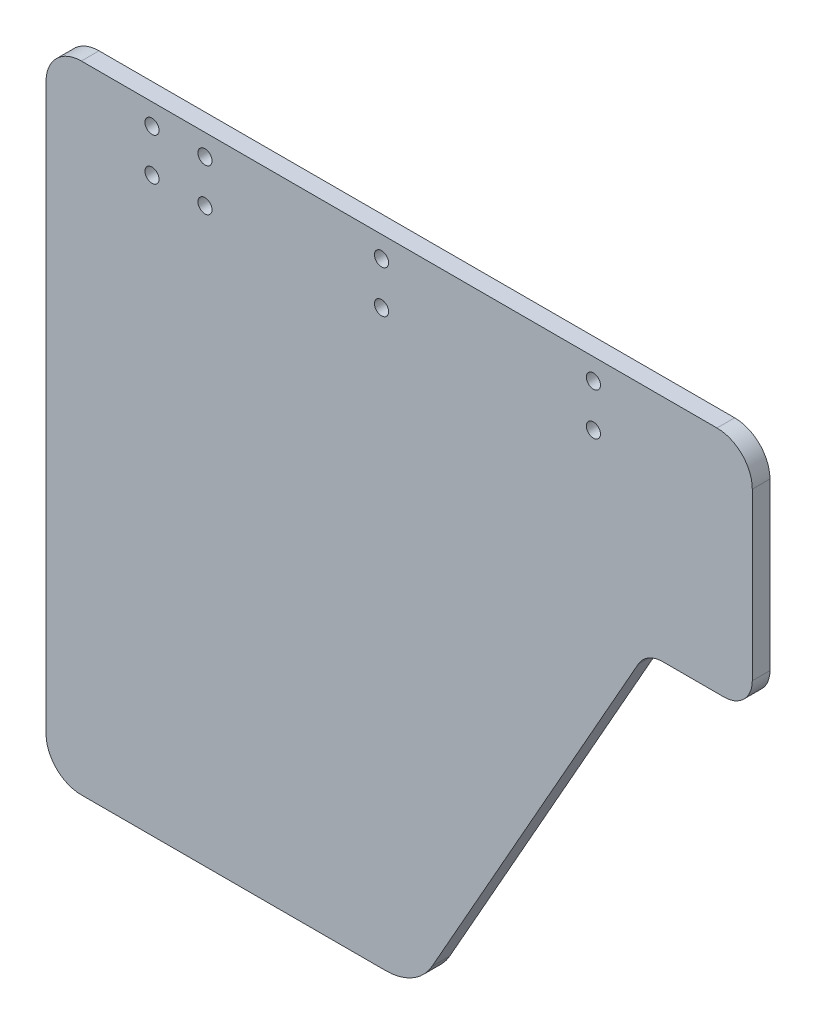
ISO-10303-21;
HEADER;
FILE_DESCRIPTION(('STEP AP214'),'2;1');
FILE_NAME('part.step','',(''),(''),'','','');
FILE_SCHEMA(('AUTOMOTIVE_DESIGN { 1 0 10303 214 1 1 1 1 }'));
ENDSEC;
DATA;
#1=APPLICATION_CONTEXT('core data for automotive mechanical design processes');
#2=APPLICATION_PROTOCOL_DEFINITION('international standard','automotive_design',2000,#1);
#3=PRODUCT_CONTEXT('',#1,'mechanical');
#4=PRODUCT('Part','Part','',(#3));
#5=PRODUCT_RELATED_PRODUCT_CATEGORY('part','',(#4));
#6=PRODUCT_DEFINITION_FORMATION('','',#4);
#7=PRODUCT_DEFINITION_CONTEXT('part definition',#1,'design');
#8=PRODUCT_DEFINITION('design','',#6,#7);
#9=PRODUCT_DEFINITION_SHAPE('','',#8);
#10=(LENGTH_UNIT() NAMED_UNIT(*) SI_UNIT(.MILLI.,.METRE.));
#11=(NAMED_UNIT(*) PLANE_ANGLE_UNIT() SI_UNIT($,.RADIAN.));
#12=(NAMED_UNIT(*) SI_UNIT($,.STERADIAN.) SOLID_ANGLE_UNIT());
#13=UNCERTAINTY_MEASURE_WITH_UNIT(LENGTH_MEASURE(1.E-05),#10,'distance_accuracy_value','');
#14=(GEOMETRIC_REPRESENTATION_CONTEXT(3) GLOBAL_UNCERTAINTY_ASSIGNED_CONTEXT((#13)) GLOBAL_UNIT_ASSIGNED_CONTEXT((#10,
#11,#12)) REPRESENTATION_CONTEXT('',''));
#15=CARTESIAN_POINT('',(0.,0.,0.));
#16=DIRECTION('',(0.,0.,1.));
#17=DIRECTION('',(1.,0.,0.));
#18=AXIS2_PLACEMENT_3D('',#15,#16,#17);
#19=CARTESIAN_POINT('',(-100.,-90.,5.));
#20=DIRECTION('',(1.,0.,0.));
#21=DIRECTION('',(0.,0.,-1.));
#22=AXIS2_PLACEMENT_3D('',#19,#20,#21);
#23=PLANE('',#22);
#24=DIRECTION('',(0.,-1.,0.));
#25=VECTOR('',#24,1.);
#26=CARTESIAN_POINT('',(-100.,-90.,0.));
#27=LINE('',#26,#25);
#28=CARTESIAN_POINT('',(-100.,79.9999999999999,0.));
#29=VERTEX_POINT('',#28);
#30=CARTESIAN_POINT('',(-100.,-80.,0.));
#31=VERTEX_POINT('',#30);
#32=EDGE_CURVE('E249',#29,#31,#27,.T.);
#33=ORIENTED_EDGE('',*,*,#32,.T.);
#34=DIRECTION('',(0.,0.,-1.));
#35=VECTOR('',#34,1.);
#36=CARTESIAN_POINT('',(-100.,-80.,5.));
#37=LINE('',#36,#35);
#38=CARTESIAN_POINT('',(-100.,-80.,5.));
#39=VERTEX_POINT('',#38);
#40=EDGE_CURVE('E186',#31,#39,#37,.F.);
#41=ORIENTED_EDGE('',*,*,#40,.T.);
#42=DIRECTION('',(0.,-1.,0.));
#43=VECTOR('',#42,1.);
#44=CARTESIAN_POINT('',(-100.,-90.,5.));
#45=LINE('',#44,#43);
#46=CARTESIAN_POINT('',(-100.,79.9999999999999,5.));
#47=VERTEX_POINT('',#46);
#48=EDGE_CURVE('E241',#47,#39,#45,.T.);
#49=ORIENTED_EDGE('',*,*,#48,.F.);
#50=DIRECTION('',(0.,0.,-1.));
#51=VECTOR('',#50,1.);
#52=CARTESIAN_POINT('',(-100.,80.,5.));
#53=LINE('',#52,#51);
#54=EDGE_CURVE('E182',#47,#29,#53,.T.);
#55=ORIENTED_EDGE('',*,*,#54,.T.);
#56=EDGE_LOOP('',(#33,#41,#49,#55));
#57=FACE_BOUND('',#56,.T.);
#58=ADVANCED_FACE('F39',(#57),#23,.F.);
#59=CARTESIAN_POINT('',(100.,-90.,5.));
#60=DIRECTION('',(0.,1.,0.));
#61=DIRECTION('',(-1.,0.,0.));
#62=AXIS2_PLACEMENT_3D('',#59,#60,#61);
#63=PLANE('',#62);
#64=DIRECTION('',(1.,0.,0.));
#65=VECTOR('',#64,1.);
#66=CARTESIAN_POINT('',(100.,-90.,0.));
#67=LINE('',#66,#65);
#68=CARTESIAN_POINT('',(-90.,-90.,0.));
#69=VERTEX_POINT('',#68);
#70=CARTESIAN_POINT('',(-3.75197149602982,-90.,0.));
#71=VERTEX_POINT('',#70);
#72=EDGE_CURVE('E142',#69,#71,#67,.T.);
#73=ORIENTED_EDGE('',*,*,#72,.T.);
#74=DIRECTION('',(0.,0.,1.));
#75=VECTOR('',#74,1.);
#76=CARTESIAN_POINT('',(-3.75197149602982,-90.,5.));
#77=LINE('',#76,#75);
#78=CARTESIAN_POINT('',(-3.75197149602982,-90.,5.));
#79=VERTEX_POINT('',#78);
#80=EDGE_CURVE('E220',#71,#79,#77,.T.);
#81=ORIENTED_EDGE('',*,*,#80,.T.);
#82=DIRECTION('',(1.,0.,0.));
#83=VECTOR('',#82,1.);
#84=CARTESIAN_POINT('',(100.,-90.,5.));
#85=LINE('',#84,#83);
#86=CARTESIAN_POINT('',(-90.,-90.,5.));
#87=VERTEX_POINT('',#86);
#88=EDGE_CURVE('E231',#87,#79,#85,.T.);
#89=ORIENTED_EDGE('',*,*,#88,.F.);
#90=DIRECTION('',(0.,0.,-1.));
#91=VECTOR('',#90,1.);
#92=CARTESIAN_POINT('',(-90.,-90.,5.));
#93=LINE('',#92,#91);
#94=EDGE_CURVE('E170',#87,#69,#93,.T.);
#95=ORIENTED_EDGE('',*,*,#94,.T.);
#96=EDGE_LOOP('',(#73,#81,#89,#95));
#97=FACE_BOUND('',#96,.T.);
#98=ADVANCED_FACE('F230',(#97),#63,.F.);
#99=CARTESIAN_POINT('',(100.,-90.,5.));
#100=DIRECTION('',(-1.,0.,0.));
#101=DIRECTION('',(0.,0.,1.));
#102=AXIS2_PLACEMENT_3D('',#99,#100,#101);
#103=PLANE('',#102);
#104=DIRECTION('',(0.,1.,0.));
#105=VECTOR('',#104,1.);
#106=CARTESIAN_POINT('',(100.,-90.,5.));
#107=LINE('',#106,#105);
#108=CARTESIAN_POINT('',(100.,33.,5.));
#109=VERTEX_POINT('',#108);
#110=CARTESIAN_POINT('',(100.,79.9999999999999,5.));
#111=VERTEX_POINT('',#110);
#112=EDGE_CURVE('E161',#109,#111,#107,.T.);
#113=ORIENTED_EDGE('',*,*,#112,.F.);
#114=DIRECTION('',(0.,0.,1.));
#115=VECTOR('',#114,1.);
#116=CARTESIAN_POINT('',(100.,33.,5.));
#117=LINE('',#116,#115);
#118=CARTESIAN_POINT('',(100.,33.,0.));
#119=VERTEX_POINT('',#118);
#120=EDGE_CURVE('E137',#109,#119,#117,.F.);
#121=ORIENTED_EDGE('',*,*,#120,.T.);
#122=DIRECTION('',(0.,1.,0.));
#123=VECTOR('',#122,1.);
#124=CARTESIAN_POINT('',(100.,-90.,0.));
#125=LINE('',#124,#123);
#126=CARTESIAN_POINT('',(100.,79.9999999999999,0.));
#127=VERTEX_POINT('',#126);
#128=EDGE_CURVE('E129',#119,#127,#125,.T.);
#129=ORIENTED_EDGE('',*,*,#128,.T.);
#130=DIRECTION('',(0.,0.,-1.));
#131=VECTOR('',#130,1.);
#132=CARTESIAN_POINT('',(100.,80.,5.));
#133=LINE('',#132,#131);
#134=EDGE_CURVE('E134',#127,#111,#133,.F.);
#135=ORIENTED_EDGE('',*,*,#134,.T.);
#136=EDGE_LOOP('',(#113,#121,#129,#135));
#137=FACE_BOUND('',#136,.T.);
#138=ADVANCED_FACE('F132',(#137),#103,.F.);
#139=CARTESIAN_POINT('',(100.,90.,5.));
#140=DIRECTION('',(0.,-1.,0.));
#141=DIRECTION('',(1.,0.,0.));
#142=AXIS2_PLACEMENT_3D('',#139,#140,#141);
#143=PLANE('',#142);
#144=DIRECTION('',(-1.,0.,0.));
#145=VECTOR('',#144,1.);
#146=CARTESIAN_POINT('',(100.,90.,0.));
#147=LINE('',#146,#145);
#148=CARTESIAN_POINT('',(90.,90.,0.));
#149=VERTEX_POINT('',#148);
#150=CARTESIAN_POINT('',(-90.,90.,0.));
#151=VERTEX_POINT('',#150);
#152=EDGE_CURVE('E141',#149,#151,#147,.T.);
#153=ORIENTED_EDGE('',*,*,#152,.T.);
#154=DIRECTION('',(0.,0.,-1.));
#155=VECTOR('',#154,1.);
#156=CARTESIAN_POINT('',(-90.,90.,5.));
#157=LINE('',#156,#155);
#158=CARTESIAN_POINT('',(-90.,90.,5.));
#159=VERTEX_POINT('',#158);
#160=EDGE_CURVE('E192',#151,#159,#157,.F.);
#161=ORIENTED_EDGE('',*,*,#160,.T.);
#162=DIRECTION('',(-1.,0.,0.));
#163=VECTOR('',#162,1.);
#164=CARTESIAN_POINT('',(100.,90.,5.));
#165=LINE('',#164,#163);
#166=CARTESIAN_POINT('',(90.,90.,5.));
#167=VERTEX_POINT('',#166);
#168=EDGE_CURVE('E157',#167,#159,#165,.T.);
#169=ORIENTED_EDGE('',*,*,#168,.F.);
#170=DIRECTION('',(0.,0.,-1.));
#171=VECTOR('',#170,1.);
#172=CARTESIAN_POINT('',(90.,90.,5.));
#173=LINE('',#172,#171);
#174=EDGE_CURVE('E189',#167,#149,#173,.T.);
#175=ORIENTED_EDGE('',*,*,#174,.T.);
#176=EDGE_LOOP('',(#153,#161,#169,#175));
#177=FACE_BOUND('',#176,.T.);
#178=ADVANCED_FACE('F348',(#177),#143,.F.);
#179=CARTESIAN_POINT('',(0.,0.,5.));
#180=DIRECTION('',(0.,0.,1.));
#181=DIRECTION('',(1.,0.,0.));
#182=AXIS2_PLACEMENT_3D('',#179,#180,#181);
#183=PLANE('',#182);
#184=ORIENTED_EDGE('',*,*,#88,.T.);
#185=CARTESIAN_POINT('',(-3.75197149602982,-75.,5.));
#186=DIRECTION('',(0.,0.,1.));
#187=DIRECTION('',(1.,0.,0.));
#188=AXIS2_PLACEMENT_3D('',#185,#186,#187);
#189=CIRCLE('',#188,15.);
#190=CARTESIAN_POINT('',(9.3064710847722,-82.3808588500185,5.));
#191=VERTEX_POINT('',#190);
#192=EDGE_CURVE('E62',#79,#191,#189,.T.);
#193=ORIENTED_EDGE('',*,*,#192,.T.);
#194=DIRECTION('',(-0.492057256667902,-0.870562838720134,0.));
#195=VECTOR('',#194,1.);
#196=CARTESIAN_POINT('',(70.,25.,5.));
#197=LINE('',#196,#195);
#198=CARTESIAN_POINT('',(67.7032154214549,20.9364580533432,5.));
#199=VERTEX_POINT('',#198);
#200=EDGE_CURVE('E329',#199,#191,#197,.T.);
#201=ORIENTED_EDGE('',*,*,#200,.F.);
#202=CARTESIAN_POINT('',(74.667718131216,17.,5.));
#203=DIRECTION('',(0.,0.,1.));
#204=DIRECTION('',(1.,0.,0.));
#205=AXIS2_PLACEMENT_3D('',#202,#203,#204);
#206=CIRCLE('',#205,8.);
#207=CARTESIAN_POINT('',(74.667718131216,25.,5.));
#208=VERTEX_POINT('',#207);
#209=EDGE_CURVE('E214',#199,#208,#206,.F.);
#210=ORIENTED_EDGE('',*,*,#209,.T.);
#211=DIRECTION('',(-1.,0.,0.));
#212=VECTOR('',#211,1.);
#213=CARTESIAN_POINT('',(100.,25.,5.));
#214=LINE('',#213,#212);
#215=CARTESIAN_POINT('',(92.,25.,5.));
#216=VERTEX_POINT('',#215);
#217=EDGE_CURVE('E322',#216,#208,#214,.T.);
#218=ORIENTED_EDGE('',*,*,#217,.F.);
#219=CARTESIAN_POINT('',(92.,33.,5.));
#220=DIRECTION('',(0.,0.,1.));
#221=DIRECTION('',(1.,0.,0.));
#222=AXIS2_PLACEMENT_3D('',#219,#220,#221);
#223=CIRCLE('',#222,8.);
#224=EDGE_CURVE('E206',#216,#109,#223,.T.);
#225=ORIENTED_EDGE('',*,*,#224,.T.);
#226=ORIENTED_EDGE('',*,*,#112,.T.);
#227=CARTESIAN_POINT('',(90.,80.,5.));
#228=DIRECTION('',(0.,0.,1.));
#229=DIRECTION('',(1.,0.,0.));
#230=AXIS2_PLACEMENT_3D('',#227,#228,#229);
#231=CIRCLE('',#230,10.);
#232=EDGE_CURVE('E155',#111,#167,#231,.T.);
#233=ORIENTED_EDGE('',*,*,#232,.T.);
#234=ORIENTED_EDGE('',*,*,#168,.T.);
#235=CARTESIAN_POINT('',(-90.,80.,5.));
#236=DIRECTION('',(0.,0.,1.));
#237=DIRECTION('',(1.,0.,0.));
#238=AXIS2_PLACEMENT_3D('',#235,#236,#237);
#239=CIRCLE('',#238,10.);
#240=EDGE_CURVE('E176',#159,#47,#239,.T.);
#241=ORIENTED_EDGE('',*,*,#240,.T.);
#242=ORIENTED_EDGE('',*,*,#48,.T.);
#243=CARTESIAN_POINT('',(-90.,-80.,5.));
#244=DIRECTION('',(0.,0.,1.));
#245=DIRECTION('',(1.,0.,0.));
#246=AXIS2_PLACEMENT_3D('',#243,#244,#245);
#247=CIRCLE('',#246,10.);
#248=EDGE_CURVE('E179',#39,#87,#247,.T.);
#249=ORIENTED_EDGE('',*,*,#248,.T.);
#250=EDGE_LOOP('',(#184,#193,#201,#210,#218,#225,#226,#233,#234,#241,#242,#249));
#251=FACE_BOUND('',#250,.T.);
#252=CARTESIAN_POINT('',(-70.,72.,5.));
#253=DIRECTION('',(0.,0.,1.));
#254=DIRECTION('',(1.,0.,0.));
#255=AXIS2_PLACEMENT_3D('',#252,#253,#254);
#256=CIRCLE('',#255,2.);
#257=CARTESIAN_POINT('',(-68.,72.,5.));
#258=VERTEX_POINT('',#257);
#259=EDGE_CURVE('E266',#258,#258,#256,.T.);
#260=ORIENTED_EDGE('',*,*,#259,.F.);
#261=EDGE_LOOP('',(#260));
#262=FACE_BOUND('',#261,.T.);
#263=CARTESIAN_POINT('',(-55.,84.,5.));
#264=DIRECTION('',(0.,0.,1.));
#265=DIRECTION('',(1.,0.,0.));
#266=AXIS2_PLACEMENT_3D('',#263,#264,#265);
#267=CIRCLE('',#266,2.);
#268=CARTESIAN_POINT('',(-53.,84.,5.));
#269=VERTEX_POINT('',#268);
#270=EDGE_CURVE('E274',#269,#269,#267,.T.);
#271=ORIENTED_EDGE('',*,*,#270,.F.);
#272=EDGE_LOOP('',(#271));
#273=FACE_BOUND('',#272,.T.);
#274=CARTESIAN_POINT('',(-55.,72.,5.));
#275=DIRECTION('',(0.,0.,1.));
#276=DIRECTION('',(1.,0.,0.));
#277=AXIS2_PLACEMENT_3D('',#274,#275,#276);
#278=CIRCLE('',#277,2.);
#279=CARTESIAN_POINT('',(-53.,72.,5.));
#280=VERTEX_POINT('',#279);
#281=EDGE_CURVE('E282',#280,#280,#278,.T.);
#282=ORIENTED_EDGE('',*,*,#281,.F.);
#283=EDGE_LOOP('',(#282));
#284=FACE_BOUND('',#283,.T.);
#285=CARTESIAN_POINT('',(-4.99999999999999,84.,5.));
#286=DIRECTION('',(0.,0.,1.));
#287=DIRECTION('',(1.,0.,0.));
#288=AXIS2_PLACEMENT_3D('',#285,#286,#287);
#289=CIRCLE('',#288,2.);
#290=CARTESIAN_POINT('',(-2.99999999999999,84.,5.));
#291=VERTEX_POINT('',#290);
#292=EDGE_CURVE('E290',#291,#291,#289,.T.);
#293=ORIENTED_EDGE('',*,*,#292,.F.);
#294=EDGE_LOOP('',(#293));
#295=FACE_BOUND('',#294,.T.);
#296=CARTESIAN_POINT('',(-5.,72.,5.));
#297=DIRECTION('',(0.,0.,1.));
#298=DIRECTION('',(1.,0.,0.));
#299=AXIS2_PLACEMENT_3D('',#296,#297,#298);
#300=CIRCLE('',#299,2.);
#301=CARTESIAN_POINT('',(-3.,72.,5.));
#302=VERTEX_POINT('',#301);
#303=EDGE_CURVE('E298',#302,#302,#300,.T.);
#304=ORIENTED_EDGE('',*,*,#303,.F.);
#305=EDGE_LOOP('',(#304));
#306=FACE_BOUND('',#305,.T.);
#307=CARTESIAN_POINT('',(55.,84.,5.));
#308=DIRECTION('',(0.,0.,1.));
#309=DIRECTION('',(1.,0.,0.));
#310=AXIS2_PLACEMENT_3D('',#307,#308,#309);
#311=CIRCLE('',#310,2.);
#312=CARTESIAN_POINT('',(57.,84.,5.));
#313=VERTEX_POINT('',#312);
#314=EDGE_CURVE('E306',#313,#313,#311,.T.);
#315=ORIENTED_EDGE('',*,*,#314,.F.);
#316=EDGE_LOOP('',(#315));
#317=FACE_BOUND('',#316,.T.);
#318=CARTESIAN_POINT('',(55.,72.,5.));
#319=DIRECTION('',(0.,0.,1.));
#320=DIRECTION('',(1.,0.,0.));
#321=AXIS2_PLACEMENT_3D('',#318,#319,#320);
#322=CIRCLE('',#321,2.00000000000001);
#323=CARTESIAN_POINT('',(57.,72.,5.));
#324=VERTEX_POINT('',#323);
#325=EDGE_CURVE('E314',#324,#324,#322,.T.);
#326=ORIENTED_EDGE('',*,*,#325,.F.);
#327=EDGE_LOOP('',(#326));
#328=FACE_BOUND('',#327,.T.);
#329=CARTESIAN_POINT('',(-70.,84.,5.));
#330=DIRECTION('',(0.,0.,1.));
#331=DIRECTION('',(1.,0.,0.));
#332=AXIS2_PLACEMENT_3D('',#329,#330,#331);
#333=CIRCLE('',#332,2.);
#334=CARTESIAN_POINT('',(-68.,84.,5.));
#335=VERTEX_POINT('',#334);
#336=EDGE_CURVE('E259',#335,#335,#333,.T.);
#337=ORIENTED_EDGE('',*,*,#336,.F.);
#338=EDGE_LOOP('',(#337));
#339=FACE_BOUND('',#338,.T.);
#340=ADVANCED_FACE('F236',(#251,#262,#273,#284,#295,#306,#317,#328,#339),#183,.T.);
#341=CARTESIAN_POINT('',(0.,0.,0.));
#342=DIRECTION('',(0.,0.,1.));
#343=DIRECTION('',(1.,0.,0.));
#344=AXIS2_PLACEMENT_3D('',#341,#342,#343);
#345=PLANE('',#344);
#346=CARTESIAN_POINT('',(-70.,72.,0.));
#347=DIRECTION('',(0.,0.,1.));
#348=DIRECTION('',(1.,0.,0.));
#349=AXIS2_PLACEMENT_3D('',#346,#347,#348);
#350=CIRCLE('',#349,2.);
#351=CARTESIAN_POINT('',(-68.,72.,0.));
#352=VERTEX_POINT('',#351);
#353=EDGE_CURVE('E263',#352,#352,#350,.T.);
#354=ORIENTED_EDGE('',*,*,#353,.T.);
#355=EDGE_LOOP('',(#354));
#356=FACE_BOUND('',#355,.T.);
#357=CARTESIAN_POINT('',(-55.,84.,0.));
#358=DIRECTION('',(0.,0.,1.));
#359=DIRECTION('',(1.,0.,0.));
#360=AXIS2_PLACEMENT_3D('',#357,#358,#359);
#361=CIRCLE('',#360,2.);
#362=CARTESIAN_POINT('',(-53.,84.,0.));
#363=VERTEX_POINT('',#362);
#364=EDGE_CURVE('E270',#363,#363,#361,.T.);
#365=ORIENTED_EDGE('',*,*,#364,.T.);
#366=EDGE_LOOP('',(#365));
#367=FACE_BOUND('',#366,.T.);
#368=CARTESIAN_POINT('',(-55.,72.,0.));
#369=DIRECTION('',(0.,0.,1.));
#370=DIRECTION('',(1.,0.,0.));
#371=AXIS2_PLACEMENT_3D('',#368,#369,#370);
#372=CIRCLE('',#371,2.);
#373=CARTESIAN_POINT('',(-53.,72.,0.));
#374=VERTEX_POINT('',#373);
#375=EDGE_CURVE('E278',#374,#374,#372,.T.);
#376=ORIENTED_EDGE('',*,*,#375,.T.);
#377=EDGE_LOOP('',(#376));
#378=FACE_BOUND('',#377,.T.);
#379=CARTESIAN_POINT('',(-4.99999999999999,84.,0.));
#380=DIRECTION('',(0.,0.,1.));
#381=DIRECTION('',(1.,0.,0.));
#382=AXIS2_PLACEMENT_3D('',#379,#380,#381);
#383=CIRCLE('',#382,2.);
#384=CARTESIAN_POINT('',(-2.99999999999999,84.,0.));
#385=VERTEX_POINT('',#384);
#386=EDGE_CURVE('E286',#385,#385,#383,.T.);
#387=ORIENTED_EDGE('',*,*,#386,.T.);
#388=EDGE_LOOP('',(#387));
#389=FACE_BOUND('',#388,.T.);
#390=CARTESIAN_POINT('',(-5.,72.,0.));
#391=DIRECTION('',(0.,0.,1.));
#392=DIRECTION('',(1.,0.,0.));
#393=AXIS2_PLACEMENT_3D('',#390,#391,#392);
#394=CIRCLE('',#393,2.);
#395=CARTESIAN_POINT('',(-3.,72.,0.));
#396=VERTEX_POINT('',#395);
#397=EDGE_CURVE('E294',#396,#396,#394,.T.);
#398=ORIENTED_EDGE('',*,*,#397,.T.);
#399=EDGE_LOOP('',(#398));
#400=FACE_BOUND('',#399,.T.);
#401=CARTESIAN_POINT('',(55.,84.,0.));
#402=DIRECTION('',(0.,0.,1.));
#403=DIRECTION('',(1.,0.,0.));
#404=AXIS2_PLACEMENT_3D('',#401,#402,#403);
#405=CIRCLE('',#404,2.);
#406=CARTESIAN_POINT('',(57.,84.,0.));
#407=VERTEX_POINT('',#406);
#408=EDGE_CURVE('E302',#407,#407,#405,.T.);
#409=ORIENTED_EDGE('',*,*,#408,.T.);
#410=EDGE_LOOP('',(#409));
#411=FACE_BOUND('',#410,.T.);
#412=CARTESIAN_POINT('',(55.,72.,0.));
#413=DIRECTION('',(0.,0.,1.));
#414=DIRECTION('',(1.,0.,0.));
#415=AXIS2_PLACEMENT_3D('',#412,#413,#414);
#416=CIRCLE('',#415,2.00000000000001);
#417=CARTESIAN_POINT('',(57.,72.,0.));
#418=VERTEX_POINT('',#417);
#419=EDGE_CURVE('E310',#418,#418,#416,.T.);
#420=ORIENTED_EDGE('',*,*,#419,.T.);
#421=EDGE_LOOP('',(#420));
#422=FACE_BOUND('',#421,.T.);
#423=CARTESIAN_POINT('',(-70.,84.,0.));
#424=DIRECTION('',(0.,0.,1.));
#425=DIRECTION('',(1.,0.,0.));
#426=AXIS2_PLACEMENT_3D('',#423,#424,#425);
#427=CIRCLE('',#426,2.);
#428=CARTESIAN_POINT('',(-68.,84.,0.));
#429=VERTEX_POINT('',#428);
#430=EDGE_CURVE('E253',#429,#429,#427,.T.);
#431=ORIENTED_EDGE('',*,*,#430,.T.);
#432=EDGE_LOOP('',(#431));
#433=FACE_BOUND('',#432,.T.);
#434=DIRECTION('',(-0.492057256667902,-0.870562838720134,0.));
#435=VECTOR('',#434,1.);
#436=CARTESIAN_POINT('',(70.,25.,0.));
#437=LINE('',#436,#435);
#438=CARTESIAN_POINT('',(67.7032154214549,20.9364580533432,0.));
#439=VERTEX_POINT('',#438);
#440=CARTESIAN_POINT('',(9.3064710847722,-82.3808588500185,0.));
#441=VERTEX_POINT('',#440);
#442=EDGE_CURVE('E326',#439,#441,#437,.T.);
#443=ORIENTED_EDGE('',*,*,#442,.T.);
#444=CARTESIAN_POINT('',(-3.75197149602982,-75.,0.));
#445=DIRECTION('',(0.,0.,1.));
#446=DIRECTION('',(1.,0.,0.));
#447=AXIS2_PLACEMENT_3D('',#444,#445,#446);
#448=CIRCLE('',#447,15.);
#449=EDGE_CURVE('E11',#441,#71,#448,.F.);
#450=ORIENTED_EDGE('',*,*,#449,.T.);
#451=ORIENTED_EDGE('',*,*,#72,.F.);
#452=CARTESIAN_POINT('',(-90.,-80.,0.));
#453=DIRECTION('',(0.,0.,1.));
#454=DIRECTION('',(1.,0.,0.));
#455=AXIS2_PLACEMENT_3D('',#452,#453,#454);
#456=CIRCLE('',#455,10.);
#457=EDGE_CURVE('E167',#69,#31,#456,.F.);
#458=ORIENTED_EDGE('',*,*,#457,.T.);
#459=ORIENTED_EDGE('',*,*,#32,.F.);
#460=CARTESIAN_POINT('',(-90.,80.,0.));
#461=DIRECTION('',(0.,0.,1.));
#462=DIRECTION('',(1.,0.,0.));
#463=AXIS2_PLACEMENT_3D('',#460,#461,#462);
#464=CIRCLE('',#463,10.);
#465=EDGE_CURVE('E152',#29,#151,#464,.F.);
#466=ORIENTED_EDGE('',*,*,#465,.T.);
#467=ORIENTED_EDGE('',*,*,#152,.F.);
#468=CARTESIAN_POINT('',(90.,80.,0.));
#469=DIRECTION('',(0.,0.,1.));
#470=DIRECTION('',(1.,0.,0.));
#471=AXIS2_PLACEMENT_3D('',#468,#469,#470);
#472=CIRCLE('',#471,10.);
#473=EDGE_CURVE('E145',#149,#127,#472,.F.);
#474=ORIENTED_EDGE('',*,*,#473,.T.);
#475=ORIENTED_EDGE('',*,*,#128,.F.);
#476=CARTESIAN_POINT('',(92.,33.,0.));
#477=DIRECTION('',(0.,0.,1.));
#478=DIRECTION('',(1.,0.,0.));
#479=AXIS2_PLACEMENT_3D('',#476,#477,#478);
#480=CIRCLE('',#479,8.);
#481=CARTESIAN_POINT('',(92.,25.,0.));
#482=VERTEX_POINT('',#481);
#483=EDGE_CURVE('E211',#119,#482,#480,.F.);
#484=ORIENTED_EDGE('',*,*,#483,.T.);
#485=DIRECTION('',(-1.,0.,0.));
#486=VECTOR('',#485,1.);
#487=CARTESIAN_POINT('',(100.,25.,0.));
#488=LINE('',#487,#486);
#489=CARTESIAN_POINT('',(74.667718131216,25.,0.));
#490=VERTEX_POINT('',#489);
#491=EDGE_CURVE('E318',#482,#490,#488,.T.);
#492=ORIENTED_EDGE('',*,*,#491,.T.);
#493=CARTESIAN_POINT('',(74.667718131216,17.,0.));
#494=DIRECTION('',(0.,0.,1.));
#495=DIRECTION('',(1.,0.,0.));
#496=AXIS2_PLACEMENT_3D('',#493,#494,#495);
#497=CIRCLE('',#496,8.);
#498=EDGE_CURVE('E217',#490,#439,#497,.T.);
#499=ORIENTED_EDGE('',*,*,#498,.T.);
#500=EDGE_LOOP('',(#443,#450,#451,#458,#459,#466,#467,#474,#475,#484,#492,#499));
#501=FACE_BOUND('',#500,.T.);
#502=ADVANCED_FACE('F146',(#356,#367,#378,#389,#400,#411,#422,#433,#501),#345,.F.);
#503=CARTESIAN_POINT('',(-70.,84.,0.));
#504=DIRECTION('',(0.,0.,1.));
#505=DIRECTION('',(1.,0.,0.));
#506=AXIS2_PLACEMENT_3D('',#503,#504,#505);
#507=CYLINDRICAL_SURFACE('',#506,2.);
#508=ORIENTED_EDGE('',*,*,#430,.F.);
#509=EDGE_LOOP('',(#508));
#510=FACE_BOUND('',#509,.T.);
#511=ORIENTED_EDGE('',*,*,#336,.T.);
#512=EDGE_LOOP('',(#511));
#513=FACE_BOUND('',#512,.T.);
#514=ADVANCED_FACE('F383',(#510,#513),#507,.F.);
#515=CARTESIAN_POINT('',(55.,72.,0.));
#516=DIRECTION('',(0.,0.,1.));
#517=DIRECTION('',(1.,0.,0.));
#518=AXIS2_PLACEMENT_3D('',#515,#516,#517);
#519=CYLINDRICAL_SURFACE('',#518,2.00000000000001);
#520=ORIENTED_EDGE('',*,*,#419,.F.);
#521=EDGE_LOOP('',(#520));
#522=FACE_BOUND('',#521,.T.);
#523=ORIENTED_EDGE('',*,*,#325,.T.);
#524=EDGE_LOOP('',(#523));
#525=FACE_BOUND('',#524,.T.);
#526=ADVANCED_FACE('F389',(#522,#525),#519,.F.);
#527=CARTESIAN_POINT('',(55.,84.,0.));
#528=DIRECTION('',(0.,0.,1.));
#529=DIRECTION('',(1.,0.,0.));
#530=AXIS2_PLACEMENT_3D('',#527,#528,#529);
#531=CYLINDRICAL_SURFACE('',#530,2.);
#532=ORIENTED_EDGE('',*,*,#408,.F.);
#533=EDGE_LOOP('',(#532));
#534=FACE_BOUND('',#533,.T.);
#535=ORIENTED_EDGE('',*,*,#314,.T.);
#536=EDGE_LOOP('',(#535));
#537=FACE_BOUND('',#536,.T.);
#538=ADVANCED_FACE('F393',(#534,#537),#531,.F.);
#539=CARTESIAN_POINT('',(-5.,72.,0.));
#540=DIRECTION('',(0.,0.,1.));
#541=DIRECTION('',(1.,0.,0.));
#542=AXIS2_PLACEMENT_3D('',#539,#540,#541);
#543=CYLINDRICAL_SURFACE('',#542,2.);
#544=ORIENTED_EDGE('',*,*,#397,.F.);
#545=EDGE_LOOP('',(#544));
#546=FACE_BOUND('',#545,.T.);
#547=ORIENTED_EDGE('',*,*,#303,.T.);
#548=EDGE_LOOP('',(#547));
#549=FACE_BOUND('',#548,.T.);
#550=ADVANCED_FACE('F397',(#546,#549),#543,.F.);
#551=CARTESIAN_POINT('',(-4.99999999999999,84.,0.));
#552=DIRECTION('',(0.,0.,1.));
#553=DIRECTION('',(1.,0.,0.));
#554=AXIS2_PLACEMENT_3D('',#551,#552,#553);
#555=CYLINDRICAL_SURFACE('',#554,2.);
#556=ORIENTED_EDGE('',*,*,#386,.F.);
#557=EDGE_LOOP('',(#556));
#558=FACE_BOUND('',#557,.T.);
#559=ORIENTED_EDGE('',*,*,#292,.T.);
#560=EDGE_LOOP('',(#559));
#561=FACE_BOUND('',#560,.T.);
#562=ADVANCED_FACE('F401',(#558,#561),#555,.F.);
#563=CARTESIAN_POINT('',(-55.,72.,0.));
#564=DIRECTION('',(0.,0.,1.));
#565=DIRECTION('',(1.,0.,0.));
#566=AXIS2_PLACEMENT_3D('',#563,#564,#565);
#567=CYLINDRICAL_SURFACE('',#566,2.);
#568=ORIENTED_EDGE('',*,*,#375,.F.);
#569=EDGE_LOOP('',(#568));
#570=FACE_BOUND('',#569,.T.);
#571=ORIENTED_EDGE('',*,*,#281,.T.);
#572=EDGE_LOOP('',(#571));
#573=FACE_BOUND('',#572,.T.);
#574=ADVANCED_FACE('F405',(#570,#573),#567,.F.);
#575=CARTESIAN_POINT('',(-55.,84.,0.));
#576=DIRECTION('',(0.,0.,1.));
#577=DIRECTION('',(1.,0.,0.));
#578=AXIS2_PLACEMENT_3D('',#575,#576,#577);
#579=CYLINDRICAL_SURFACE('',#578,2.);
#580=ORIENTED_EDGE('',*,*,#364,.F.);
#581=EDGE_LOOP('',(#580));
#582=FACE_BOUND('',#581,.T.);
#583=ORIENTED_EDGE('',*,*,#270,.T.);
#584=EDGE_LOOP('',(#583));
#585=FACE_BOUND('',#584,.T.);
#586=ADVANCED_FACE('F367',(#582,#585),#579,.F.);
#587=CARTESIAN_POINT('',(-70.,72.,0.));
#588=DIRECTION('',(0.,0.,1.));
#589=DIRECTION('',(1.,0.,0.));
#590=AXIS2_PLACEMENT_3D('',#587,#588,#589);
#591=CYLINDRICAL_SURFACE('',#590,2.);
#592=ORIENTED_EDGE('',*,*,#353,.F.);
#593=EDGE_LOOP('',(#592));
#594=FACE_BOUND('',#593,.T.);
#595=ORIENTED_EDGE('',*,*,#259,.T.);
#596=EDGE_LOOP('',(#595));
#597=FACE_BOUND('',#596,.T.);
#598=ADVANCED_FACE('F360',(#594,#597),#591,.F.);
#599=CARTESIAN_POINT('',(-90.,-80.,5.));
#600=DIRECTION('',(0.,0.,-1.));
#601=DIRECTION('',(-1.,0.,0.));
#602=AXIS2_PLACEMENT_3D('',#599,#600,#601);
#603=CYLINDRICAL_SURFACE('',#602,10.);
#604=ORIENTED_EDGE('',*,*,#248,.F.);
#605=ORIENTED_EDGE('',*,*,#40,.F.);
#606=ORIENTED_EDGE('',*,*,#457,.F.);
#607=ORIENTED_EDGE('',*,*,#94,.F.);
#608=EDGE_LOOP('',(#604,#605,#606,#607));
#609=FACE_BOUND('',#608,.T.);
#610=ADVANCED_FACE('F358',(#609),#603,.T.);
#611=CARTESIAN_POINT('',(-90.,80.,5.));
#612=DIRECTION('',(0.,0.,-1.));
#613=DIRECTION('',(-1.,0.,0.));
#614=AXIS2_PLACEMENT_3D('',#611,#612,#613);
#615=CYLINDRICAL_SURFACE('',#614,10.);
#616=ORIENTED_EDGE('',*,*,#240,.F.);
#617=ORIENTED_EDGE('',*,*,#160,.F.);
#618=ORIENTED_EDGE('',*,*,#465,.F.);
#619=ORIENTED_EDGE('',*,*,#54,.F.);
#620=EDGE_LOOP('',(#616,#617,#618,#619));
#621=FACE_BOUND('',#620,.T.);
#622=ADVANCED_FACE('F351',(#621),#615,.T.);
#623=CARTESIAN_POINT('',(90.,80.,5.));
#624=DIRECTION('',(0.,0.,-1.));
#625=DIRECTION('',(-1.,0.,0.));
#626=AXIS2_PLACEMENT_3D('',#623,#624,#625);
#627=CYLINDRICAL_SURFACE('',#626,10.);
#628=ORIENTED_EDGE('',*,*,#232,.F.);
#629=ORIENTED_EDGE('',*,*,#134,.F.);
#630=ORIENTED_EDGE('',*,*,#473,.F.);
#631=ORIENTED_EDGE('',*,*,#174,.F.);
#632=EDGE_LOOP('',(#628,#629,#630,#631));
#633=FACE_BOUND('',#632,.T.);
#634=ADVANCED_FACE('F154',(#633),#627,.T.);
#635=CARTESIAN_POINT('',(100.,25.,0.));
#636=DIRECTION('',(0.,1.,0.));
#637=DIRECTION('',(-1.,0.,0.));
#638=AXIS2_PLACEMENT_3D('',#635,#636,#637);
#639=PLANE('',#638);
#640=ORIENTED_EDGE('',*,*,#217,.T.);
#641=DIRECTION('',(0.,0.,1.));
#642=VECTOR('',#641,1.);
#643=CARTESIAN_POINT('',(74.667718131216,25.,0.));
#644=LINE('',#643,#642);
#645=EDGE_CURVE('E203',#208,#490,#644,.F.);
#646=ORIENTED_EDGE('',*,*,#645,.T.);
#647=ORIENTED_EDGE('',*,*,#491,.F.);
#648=DIRECTION('',(0.,0.,1.));
#649=VECTOR('',#648,1.);
#650=CARTESIAN_POINT('',(92.,25.,0.));
#651=LINE('',#650,#649);
#652=EDGE_CURVE('E199',#482,#216,#651,.T.);
#653=ORIENTED_EDGE('',*,*,#652,.T.);
#654=EDGE_LOOP('',(#640,#646,#647,#653));
#655=FACE_BOUND('',#654,.T.);
#656=ADVANCED_FACE('F340',(#655),#639,.F.);
#657=CARTESIAN_POINT('',(70.,25.,0.));
#658=DIRECTION('',(-0.870562838720134,0.492057256667902,0.));
#659=DIRECTION('',(-0.492057256667902,-0.870562838720134,0.));
#660=AXIS2_PLACEMENT_3D('',#657,#658,#659);
#661=PLANE('',#660);
#662=ORIENTED_EDGE('',*,*,#200,.T.);
#663=DIRECTION('',(0.,0.,1.));
#664=VECTOR('',#663,1.);
#665=CARTESIAN_POINT('',(9.30647108477219,-82.3808588500185,0.));
#666=LINE('',#665,#664);
#667=EDGE_CURVE('E48',#191,#441,#666,.F.);
#668=ORIENTED_EDGE('',*,*,#667,.T.);
#669=ORIENTED_EDGE('',*,*,#442,.F.);
#670=DIRECTION('',(0.,0.,1.));
#671=VECTOR('',#670,1.);
#672=CARTESIAN_POINT('',(67.7032154214549,20.9364580533432,5.));
#673=LINE('',#672,#671);
#674=EDGE_CURVE('E195',#439,#199,#673,.T.);
#675=ORIENTED_EDGE('',*,*,#674,.T.);
#676=EDGE_LOOP('',(#662,#668,#669,#675));
#677=FACE_BOUND('',#676,.T.);
#678=ADVANCED_FACE('F332',(#677),#661,.F.);
#679=CARTESIAN_POINT('',(74.667718131216,17.,0.));
#680=DIRECTION('',(0.,0.,-1.));
#681=DIRECTION('',(-1.,0.,0.));
#682=AXIS2_PLACEMENT_3D('',#679,#680,#681);
#683=CYLINDRICAL_SURFACE('',#682,8.);
#684=ORIENTED_EDGE('',*,*,#498,.F.);
#685=ORIENTED_EDGE('',*,*,#645,.F.);
#686=ORIENTED_EDGE('',*,*,#209,.F.);
#687=ORIENTED_EDGE('',*,*,#674,.F.);
#688=EDGE_LOOP('',(#684,#685,#686,#687));
#689=FACE_BOUND('',#688,.T.);
#690=ADVANCED_FACE('F336',(#689),#683,.F.);
#691=CARTESIAN_POINT('',(92.,33.,0.));
#692=DIRECTION('',(0.,0.,1.));
#693=DIRECTION('',(1.,0.,0.));
#694=AXIS2_PLACEMENT_3D('',#691,#692,#693);
#695=CYLINDRICAL_SURFACE('',#694,8.);
#696=ORIENTED_EDGE('',*,*,#483,.F.);
#697=ORIENTED_EDGE('',*,*,#120,.F.);
#698=ORIENTED_EDGE('',*,*,#224,.F.);
#699=ORIENTED_EDGE('',*,*,#652,.F.);
#700=EDGE_LOOP('',(#696,#697,#698,#699));
#701=FACE_BOUND('',#700,.T.);
#702=ADVANCED_FACE('F344',(#701),#695,.T.);
#703=CARTESIAN_POINT('',(-3.75197149602982,-75.,5.));
#704=DIRECTION('',(0.,0.,1.));
#705=DIRECTION('',(1.,0.,0.));
#706=AXIS2_PLACEMENT_3D('',#703,#704,#705);
#707=CYLINDRICAL_SURFACE('',#706,15.);
#708=ORIENTED_EDGE('',*,*,#449,.F.);
#709=ORIENTED_EDGE('',*,*,#667,.F.);
#710=ORIENTED_EDGE('',*,*,#192,.F.);
#711=ORIENTED_EDGE('',*,*,#80,.F.);
#712=EDGE_LOOP('',(#708,#709,#710,#711));
#713=FACE_BOUND('',#712,.T.);
#714=ADVANCED_FACE('F41',(#713),#707,.T.);
#715=CLOSED_SHELL('',(#58,#98,#138,#178,#340,#502,#514,#526,#538,#550,#562,#574,#586,#598,#610,
#622,#634,#656,#678,#690,#702,#714));
#716=MANIFOLD_SOLID_BREP('B2',#715);
#717=ADVANCED_BREP_SHAPE_REPRESENTATION('',(#18,#716),#14);
#718=SHAPE_DEFINITION_REPRESENTATION(#9,#717);
ENDSEC;
END-ISO-10303-21;
